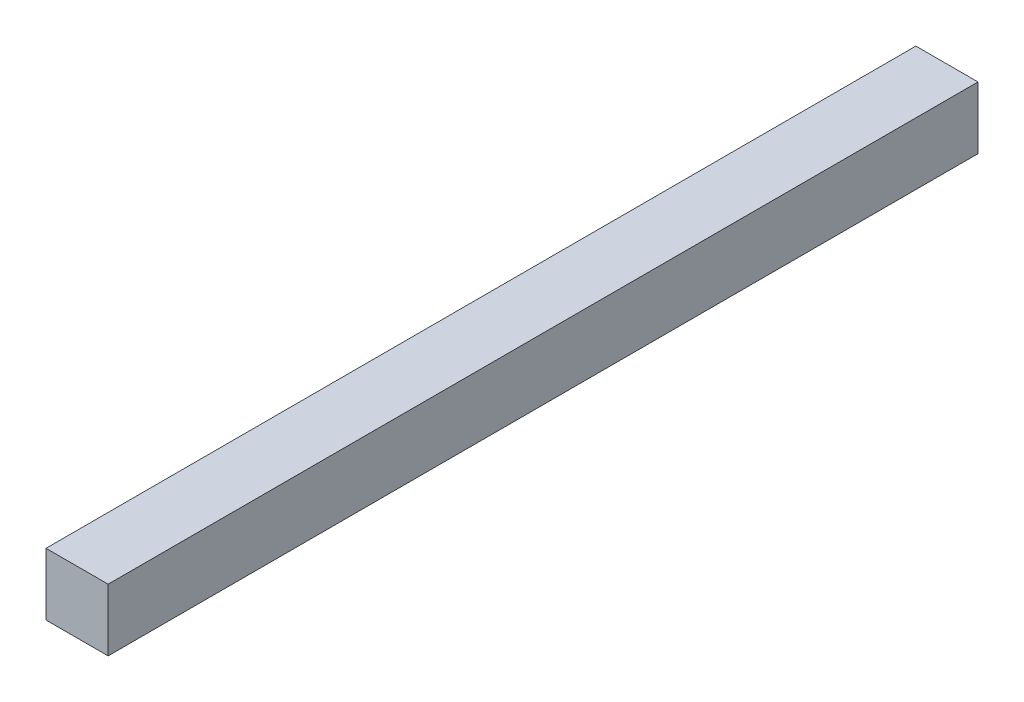
ISO-10303-21;
HEADER;
FILE_DESCRIPTION(('STEP AP214'),'2;1');
FILE_NAME('part.step','',(''),(''),'','','');
FILE_SCHEMA(('AUTOMOTIVE_DESIGN { 1 0 10303 214 1 1 1 1 }'));
ENDSEC;
DATA;
#1=APPLICATION_CONTEXT('core data for automotive mechanical design processes');
#2=APPLICATION_PROTOCOL_DEFINITION('international standard','automotive_design',2000,#1);
#3=PRODUCT_CONTEXT('',#1,'mechanical');
#4=PRODUCT('Part','Part','',(#3));
#5=PRODUCT_RELATED_PRODUCT_CATEGORY('part','',(#4));
#6=PRODUCT_DEFINITION_FORMATION('','',#4);
#7=PRODUCT_DEFINITION_CONTEXT('part definition',#1,'design');
#8=PRODUCT_DEFINITION('design','',#6,#7);
#9=PRODUCT_DEFINITION_SHAPE('','',#8);
#10=(LENGTH_UNIT() NAMED_UNIT(*) SI_UNIT(.MILLI.,.METRE.));
#11=(NAMED_UNIT(*) PLANE_ANGLE_UNIT() SI_UNIT($,.RADIAN.));
#12=(NAMED_UNIT(*) SI_UNIT($,.STERADIAN.) SOLID_ANGLE_UNIT());
#13=UNCERTAINTY_MEASURE_WITH_UNIT(LENGTH_MEASURE(1.E-05),#10,'distance_accuracy_value','');
#14=(GEOMETRIC_REPRESENTATION_CONTEXT(3) GLOBAL_UNCERTAINTY_ASSIGNED_CONTEXT((#13)) GLOBAL_UNIT_ASSIGNED_CONTEXT((#10,
#11,#12)) REPRESENTATION_CONTEXT('',''));
#15=CARTESIAN_POINT('',(0.,0.,0.));
#16=DIRECTION('',(0.,0.,1.));
#17=DIRECTION('',(1.,0.,0.));
#18=AXIS2_PLACEMENT_3D('',#15,#16,#17);
#19=CARTESIAN_POINT('',(0.,0.,11.2));
#20=DIRECTION('',(1.,0.,0.));
#21=DIRECTION('',(0.,1.,0.));
#22=AXIS2_PLACEMENT_3D('',#19,#20,#21);
#23=PLANE('',#22);
#24=DIRECTION('',(0.,-1.,0.));
#25=VECTOR('',#24,1.);
#26=CARTESIAN_POINT('',(0.,0.,0.));
#27=LINE('',#26,#25);
#28=CARTESIAN_POINT('',(0.,0.8,0.));
#29=VERTEX_POINT('',#28);
#30=CARTESIAN_POINT('',(0.,0.,0.));
#31=VERTEX_POINT('',#30);
#32=EDGE_CURVE('E95',#29,#31,#27,.T.);
#33=ORIENTED_EDGE('',*,*,#32,.T.);
#34=DIRECTION('',(0.,0.,-1.));
#35=VECTOR('',#34,1.);
#36=CARTESIAN_POINT('',(0.,0.,11.2));
#37=LINE('',#36,#35);
#38=CARTESIAN_POINT('',(0.,0.,11.2));
#39=VERTEX_POINT('',#38);
#40=EDGE_CURVE('E11',#39,#31,#37,.T.);
#41=ORIENTED_EDGE('',*,*,#40,.F.);
#42=DIRECTION('',(0.,-1.,0.));
#43=VECTOR('',#42,1.);
#44=CARTESIAN_POINT('',(0.,0.,11.2));
#45=LINE('',#44,#43);
#46=CARTESIAN_POINT('',(0.,0.8,11.2));
#47=VERTEX_POINT('',#46);
#48=EDGE_CURVE('E83',#47,#39,#45,.T.);
#49=ORIENTED_EDGE('',*,*,#48,.F.);
#50=DIRECTION('',(0.,0.,-1.));
#51=VECTOR('',#50,1.);
#52=CARTESIAN_POINT('',(0.,0.8,11.2));
#53=LINE('',#52,#51);
#54=EDGE_CURVE('E91',#47,#29,#53,.T.);
#55=ORIENTED_EDGE('',*,*,#54,.T.);
#56=EDGE_LOOP('',(#33,#41,#49,#55));
#57=FACE_BOUND('',#56,.T.);
#58=ADVANCED_FACE('F32',(#57),#23,.F.);
#59=CARTESIAN_POINT('',(0.,0.,11.2));
#60=DIRECTION('',(0.,1.,0.));
#61=DIRECTION('',(0.,0.,1.));
#62=AXIS2_PLACEMENT_3D('',#59,#60,#61);
#63=PLANE('',#62);
#64=DIRECTION('',(1.,0.,0.));
#65=VECTOR('',#64,1.);
#66=CARTESIAN_POINT('',(0.,0.,0.));
#67=LINE('',#66,#65);
#68=CARTESIAN_POINT('',(0.8,0.,0.));
#69=VERTEX_POINT('',#68);
#70=EDGE_CURVE('E87',#31,#69,#67,.T.);
#71=ORIENTED_EDGE('',*,*,#70,.T.);
#72=DIRECTION('',(0.,0.,-1.));
#73=VECTOR('',#72,1.);
#74=CARTESIAN_POINT('',(0.8,0.,11.2));
#75=LINE('',#74,#73);
#76=CARTESIAN_POINT('',(0.8,0.,11.2));
#77=VERTEX_POINT('',#76);
#78=EDGE_CURVE('E40',#77,#69,#75,.T.);
#79=ORIENTED_EDGE('',*,*,#78,.F.);
#80=DIRECTION('',(1.,0.,0.));
#81=VECTOR('',#80,1.);
#82=CARTESIAN_POINT('',(0.,0.,11.2));
#83=LINE('',#82,#81);
#84=EDGE_CURVE('E78',#39,#77,#83,.T.);
#85=ORIENTED_EDGE('',*,*,#84,.F.);
#86=ORIENTED_EDGE('',*,*,#40,.T.);
#87=EDGE_LOOP('',(#71,#79,#85,#86));
#88=FACE_BOUND('',#87,.T.);
#89=ADVANCED_FACE('F86',(#88),#63,.F.);
#90=CARTESIAN_POINT('',(0.8,0.,11.2));
#91=DIRECTION('',(-1.,0.,0.));
#92=DIRECTION('',(0.,-1.,0.));
#93=AXIS2_PLACEMENT_3D('',#90,#91,#92);
#94=PLANE('',#93);
#95=DIRECTION('',(0.,1.,0.));
#96=VECTOR('',#95,1.);
#97=CARTESIAN_POINT('',(0.8,0.,0.));
#98=LINE('',#97,#96);
#99=CARTESIAN_POINT('',(0.8,0.8,0.));
#100=VERTEX_POINT('',#99);
#101=EDGE_CURVE('E65',#69,#100,#98,.T.);
#102=ORIENTED_EDGE('',*,*,#101,.T.);
#103=DIRECTION('',(0.,0.,-1.));
#104=VECTOR('',#103,1.);
#105=CARTESIAN_POINT('',(0.8,0.8,11.2));
#106=LINE('',#105,#104);
#107=CARTESIAN_POINT('',(0.8,0.8,11.2));
#108=VERTEX_POINT('',#107);
#109=EDGE_CURVE('E88',#108,#100,#106,.T.);
#110=ORIENTED_EDGE('',*,*,#109,.F.);
#111=DIRECTION('',(0.,1.,0.));
#112=VECTOR('',#111,1.);
#113=CARTESIAN_POINT('',(0.8,0.,11.2));
#114=LINE('',#113,#112);
#115=EDGE_CURVE('E81',#77,#108,#114,.T.);
#116=ORIENTED_EDGE('',*,*,#115,.F.);
#117=ORIENTED_EDGE('',*,*,#78,.T.);
#118=EDGE_LOOP('',(#102,#110,#116,#117));
#119=FACE_BOUND('',#118,.T.);
#120=ADVANCED_FACE('F89',(#119),#94,.F.);
#121=CARTESIAN_POINT('',(0.,0.8,11.2));
#122=DIRECTION('',(0.,-1.,0.));
#123=DIRECTION('',(0.,0.,-1.));
#124=AXIS2_PLACEMENT_3D('',#121,#122,#123);
#125=PLANE('',#124);
#126=DIRECTION('',(-1.,0.,0.));
#127=VECTOR('',#126,1.);
#128=CARTESIAN_POINT('',(0.,0.8,0.));
#129=LINE('',#128,#127);
#130=EDGE_CURVE('E71',#100,#29,#129,.T.);
#131=ORIENTED_EDGE('',*,*,#130,.T.);
#132=ORIENTED_EDGE('',*,*,#54,.F.);
#133=DIRECTION('',(-1.,0.,0.));
#134=VECTOR('',#133,1.);
#135=CARTESIAN_POINT('',(0.,0.8,11.2));
#136=LINE('',#135,#134);
#137=EDGE_CURVE('E48',#108,#47,#136,.T.);
#138=ORIENTED_EDGE('',*,*,#137,.F.);
#139=ORIENTED_EDGE('',*,*,#109,.T.);
#140=EDGE_LOOP('',(#131,#132,#138,#139));
#141=FACE_BOUND('',#140,.T.);
#142=ADVANCED_FACE('F102',(#141),#125,.F.);
#143=CARTESIAN_POINT('',(0.,0.,11.2));
#144=DIRECTION('',(0.,0.,-1.));
#145=DIRECTION('',(-1.,0.,0.));
#146=AXIS2_PLACEMENT_3D('',#143,#144,#145);
#147=PLANE('',#146);
#148=ORIENTED_EDGE('',*,*,#48,.T.);
#149=ORIENTED_EDGE('',*,*,#84,.T.);
#150=ORIENTED_EDGE('',*,*,#115,.T.);
#151=ORIENTED_EDGE('',*,*,#137,.T.);
#152=EDGE_LOOP('',(#148,#149,#150,#151));
#153=FACE_BOUND('',#152,.T.);
#154=ADVANCED_FACE('F79',(#153),#147,.F.);
#155=CARTESIAN_POINT('',(0.,0.,0.));
#156=DIRECTION('',(0.,0.,-1.));
#157=DIRECTION('',(-1.,0.,0.));
#158=AXIS2_PLACEMENT_3D('',#155,#156,#157);
#159=PLANE('',#158);
#160=ORIENTED_EDGE('',*,*,#32,.F.);
#161=ORIENTED_EDGE('',*,*,#130,.F.);
#162=ORIENTED_EDGE('',*,*,#101,.F.);
#163=ORIENTED_EDGE('',*,*,#70,.F.);
#164=EDGE_LOOP('',(#160,#161,#162,#163));
#165=FACE_BOUND('',#164,.T.);
#166=ADVANCED_FACE('F105',(#165),#159,.T.);
#167=CLOSED_SHELL('',(#58,#89,#120,#142,#154,#166));
#168=MANIFOLD_SOLID_BREP('B2',#167);
#169=ADVANCED_BREP_SHAPE_REPRESENTATION('',(#18,#168),#14);
#170=SHAPE_DEFINITION_REPRESENTATION(#9,#169);
ENDSEC;
END-ISO-10303-21;
